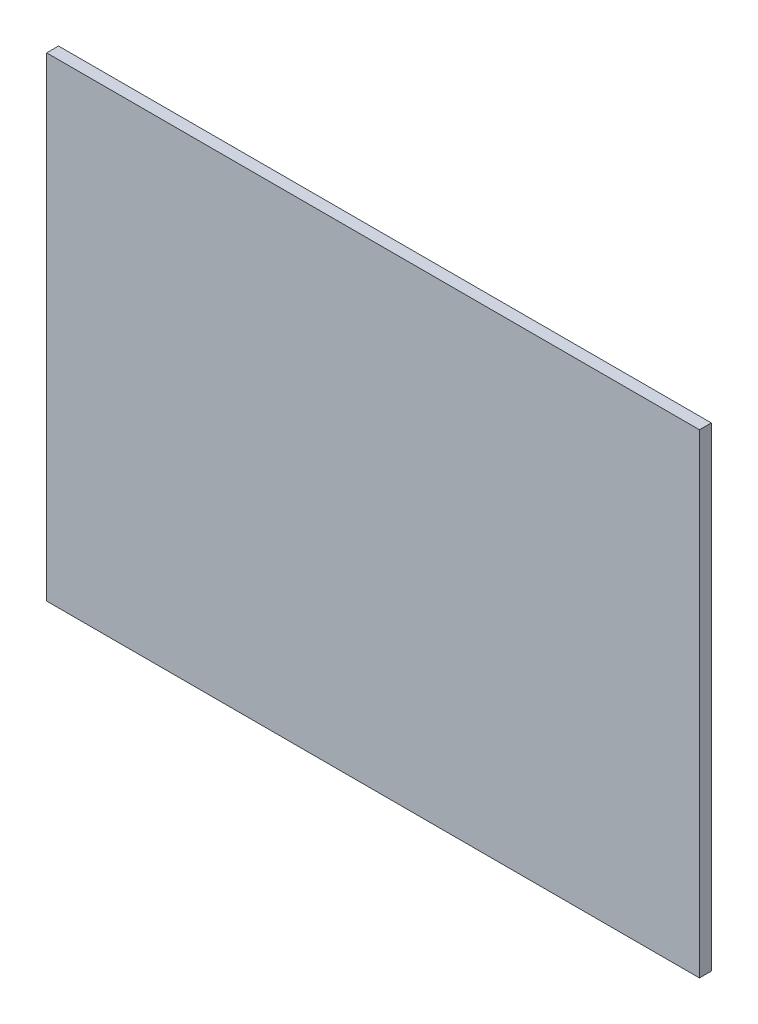
ISO-10303-21;
HEADER;
FILE_DESCRIPTION(('STEP AP214'),'2;1');
FILE_NAME('part.step','',(''),(''),'','','');
FILE_SCHEMA(('AUTOMOTIVE_DESIGN { 1 0 10303 214 1 1 1 1 }'));
ENDSEC;
DATA;
#1=APPLICATION_CONTEXT('core data for automotive mechanical design processes');
#2=APPLICATION_PROTOCOL_DEFINITION('international standard','automotive_design',2000,#1);
#3=PRODUCT_CONTEXT('',#1,'mechanical');
#4=PRODUCT('Part','Part','',(#3));
#5=PRODUCT_RELATED_PRODUCT_CATEGORY('part','',(#4));
#6=PRODUCT_DEFINITION_FORMATION('','',#4);
#7=PRODUCT_DEFINITION_CONTEXT('part definition',#1,'design');
#8=PRODUCT_DEFINITION('design','',#6,#7);
#9=PRODUCT_DEFINITION_SHAPE('','',#8);
#10=(LENGTH_UNIT() NAMED_UNIT(*) SI_UNIT(.MILLI.,.METRE.));
#11=(NAMED_UNIT(*) PLANE_ANGLE_UNIT() SI_UNIT($,.RADIAN.));
#12=(NAMED_UNIT(*) SI_UNIT($,.STERADIAN.) SOLID_ANGLE_UNIT());
#13=UNCERTAINTY_MEASURE_WITH_UNIT(LENGTH_MEASURE(1.E-05),#10,'distance_accuracy_value','');
#14=(GEOMETRIC_REPRESENTATION_CONTEXT(3) GLOBAL_UNCERTAINTY_ASSIGNED_CONTEXT((#13)) GLOBAL_UNIT_ASSIGNED_CONTEXT((#10,
#11,#12)) REPRESENTATION_CONTEXT('',''));
#15=CARTESIAN_POINT('',(0.,0.,0.));
#16=DIRECTION('',(0.,0.,1.));
#17=DIRECTION('',(1.,0.,0.));
#18=AXIS2_PLACEMENT_3D('',#15,#16,#17);
#19=CARTESIAN_POINT('',(110.,80.,4.));
#20=DIRECTION('',(-1.,0.,0.));
#21=DIRECTION('',(0.,-1.,0.));
#22=AXIS2_PLACEMENT_3D('',#19,#20,#21);
#23=PLANE('',#22);
#24=DIRECTION('',(0.,1.,0.));
#25=VECTOR('',#24,1.);
#26=CARTESIAN_POINT('',(110.,80.,0.));
#27=LINE('',#26,#25);
#28=CARTESIAN_POINT('',(110.,-80.,0.));
#29=VERTEX_POINT('',#28);
#30=CARTESIAN_POINT('',(110.,80.,0.));
#31=VERTEX_POINT('',#30);
#32=EDGE_CURVE('E96',#29,#31,#27,.T.);
#33=ORIENTED_EDGE('',*,*,#32,.T.);
#34=DIRECTION('',(0.,0.,-1.));
#35=VECTOR('',#34,1.);
#36=CARTESIAN_POINT('',(110.,80.,4.));
#37=LINE('',#36,#35);
#38=CARTESIAN_POINT('',(110.,80.,4.));
#39=VERTEX_POINT('',#38);
#40=EDGE_CURVE('E11',#39,#31,#37,.T.);
#41=ORIENTED_EDGE('',*,*,#40,.F.);
#42=DIRECTION('',(0.,1.,0.));
#43=VECTOR('',#42,1.);
#44=CARTESIAN_POINT('',(110.,80.,4.));
#45=LINE('',#44,#43);
#46=CARTESIAN_POINT('',(110.,-80.,4.));
#47=VERTEX_POINT('',#46);
#48=EDGE_CURVE('E84',#47,#39,#45,.T.);
#49=ORIENTED_EDGE('',*,*,#48,.F.);
#50=DIRECTION('',(0.,0.,-1.));
#51=VECTOR('',#50,1.);
#52=CARTESIAN_POINT('',(110.,-80.,4.));
#53=LINE('',#52,#51);
#54=EDGE_CURVE('E92',#47,#29,#53,.T.);
#55=ORIENTED_EDGE('',*,*,#54,.T.);
#56=EDGE_LOOP('',(#33,#41,#49,#55));
#57=FACE_BOUND('',#56,.T.);
#58=ADVANCED_FACE('F33',(#57),#23,.F.);
#59=CARTESIAN_POINT('',(-110.,80.,4.));
#60=DIRECTION('',(0.,-1.,0.));
#61=DIRECTION('',(0.,0.,-1.));
#62=AXIS2_PLACEMENT_3D('',#59,#60,#61);
#63=PLANE('',#62);
#64=DIRECTION('',(-1.,0.,0.));
#65=VECTOR('',#64,1.);
#66=CARTESIAN_POINT('',(-110.,80.,0.));
#67=LINE('',#66,#65);
#68=CARTESIAN_POINT('',(-110.,80.,0.));
#69=VERTEX_POINT('',#68);
#70=EDGE_CURVE('E88',#31,#69,#67,.T.);
#71=ORIENTED_EDGE('',*,*,#70,.T.);
#72=DIRECTION('',(0.,0.,-1.));
#73=VECTOR('',#72,1.);
#74=CARTESIAN_POINT('',(-110.,80.,4.));
#75=LINE('',#74,#73);
#76=CARTESIAN_POINT('',(-110.,80.,4.));
#77=VERTEX_POINT('',#76);
#78=EDGE_CURVE('E41',#77,#69,#75,.T.);
#79=ORIENTED_EDGE('',*,*,#78,.F.);
#80=DIRECTION('',(-1.,0.,0.));
#81=VECTOR('',#80,1.);
#82=CARTESIAN_POINT('',(-110.,80.,4.));
#83=LINE('',#82,#81);
#84=EDGE_CURVE('E79',#39,#77,#83,.T.);
#85=ORIENTED_EDGE('',*,*,#84,.F.);
#86=ORIENTED_EDGE('',*,*,#40,.T.);
#87=EDGE_LOOP('',(#71,#79,#85,#86));
#88=FACE_BOUND('',#87,.T.);
#89=ADVANCED_FACE('F87',(#88),#63,.F.);
#90=CARTESIAN_POINT('',(-110.,80.,4.));
#91=DIRECTION('',(1.,0.,0.));
#92=DIRECTION('',(0.,0.,-1.));
#93=AXIS2_PLACEMENT_3D('',#90,#91,#92);
#94=PLANE('',#93);
#95=DIRECTION('',(0.,-1.,0.));
#96=VECTOR('',#95,1.);
#97=CARTESIAN_POINT('',(-110.,80.,0.));
#98=LINE('',#97,#96);
#99=CARTESIAN_POINT('',(-110.,-80.,0.));
#100=VERTEX_POINT('',#99);
#101=EDGE_CURVE('E66',#69,#100,#98,.T.);
#102=ORIENTED_EDGE('',*,*,#101,.T.);
#103=DIRECTION('',(0.,0.,-1.));
#104=VECTOR('',#103,1.);
#105=CARTESIAN_POINT('',(-110.,-80.,4.));
#106=LINE('',#105,#104);
#107=CARTESIAN_POINT('',(-110.,-80.,4.));
#108=VERTEX_POINT('',#107);
#109=EDGE_CURVE('E89',#108,#100,#106,.T.);
#110=ORIENTED_EDGE('',*,*,#109,.F.);
#111=DIRECTION('',(0.,-1.,0.));
#112=VECTOR('',#111,1.);
#113=CARTESIAN_POINT('',(-110.,80.,4.));
#114=LINE('',#113,#112);
#115=EDGE_CURVE('E82',#77,#108,#114,.T.);
#116=ORIENTED_EDGE('',*,*,#115,.F.);
#117=ORIENTED_EDGE('',*,*,#78,.T.);
#118=EDGE_LOOP('',(#102,#110,#116,#117));
#119=FACE_BOUND('',#118,.T.);
#120=ADVANCED_FACE('F90',(#119),#94,.F.);
#121=CARTESIAN_POINT('',(-110.,-80.,4.));
#122=DIRECTION('',(0.,1.,0.));
#123=DIRECTION('',(0.,0.,1.));
#124=AXIS2_PLACEMENT_3D('',#121,#122,#123);
#125=PLANE('',#124);
#126=DIRECTION('',(1.,0.,0.));
#127=VECTOR('',#126,1.);
#128=CARTESIAN_POINT('',(-110.,-80.,0.));
#129=LINE('',#128,#127);
#130=EDGE_CURVE('E72',#100,#29,#129,.T.);
#131=ORIENTED_EDGE('',*,*,#130,.T.);
#132=ORIENTED_EDGE('',*,*,#54,.F.);
#133=DIRECTION('',(1.,0.,0.));
#134=VECTOR('',#133,1.);
#135=CARTESIAN_POINT('',(-110.,-80.,4.));
#136=LINE('',#135,#134);
#137=EDGE_CURVE('E49',#108,#47,#136,.T.);
#138=ORIENTED_EDGE('',*,*,#137,.F.);
#139=ORIENTED_EDGE('',*,*,#109,.T.);
#140=EDGE_LOOP('',(#131,#132,#138,#139));
#141=FACE_BOUND('',#140,.T.);
#142=ADVANCED_FACE('F103',(#141),#125,.F.);
#143=CARTESIAN_POINT('',(0.,0.,4.));
#144=DIRECTION('',(0.,0.,1.));
#145=DIRECTION('',(1.,0.,0.));
#146=AXIS2_PLACEMENT_3D('',#143,#144,#145);
#147=PLANE('',#146);
#148=ORIENTED_EDGE('',*,*,#48,.T.);
#149=ORIENTED_EDGE('',*,*,#84,.T.);
#150=ORIENTED_EDGE('',*,*,#115,.T.);
#151=ORIENTED_EDGE('',*,*,#137,.T.);
#152=EDGE_LOOP('',(#148,#149,#150,#151));
#153=FACE_BOUND('',#152,.T.);
#154=ADVANCED_FACE('F80',(#153),#147,.T.);
#155=CARTESIAN_POINT('',(0.,0.,0.));
#156=DIRECTION('',(0.,0.,1.));
#157=DIRECTION('',(1.,0.,0.));
#158=AXIS2_PLACEMENT_3D('',#155,#156,#157);
#159=PLANE('',#158);
#160=ORIENTED_EDGE('',*,*,#32,.F.);
#161=ORIENTED_EDGE('',*,*,#130,.F.);
#162=ORIENTED_EDGE('',*,*,#101,.F.);
#163=ORIENTED_EDGE('',*,*,#70,.F.);
#164=EDGE_LOOP('',(#160,#161,#162,#163));
#165=FACE_BOUND('',#164,.T.);
#166=ADVANCED_FACE('F106',(#165),#159,.F.);
#167=CLOSED_SHELL('',(#58,#89,#120,#142,#154,#166));
#168=MANIFOLD_SOLID_BREP('B2',#167);
#169=ADVANCED_BREP_SHAPE_REPRESENTATION('',(#18,#168),#14);
#170=SHAPE_DEFINITION_REPRESENTATION(#9,#169);
ENDSEC;
END-ISO-10303-21;
